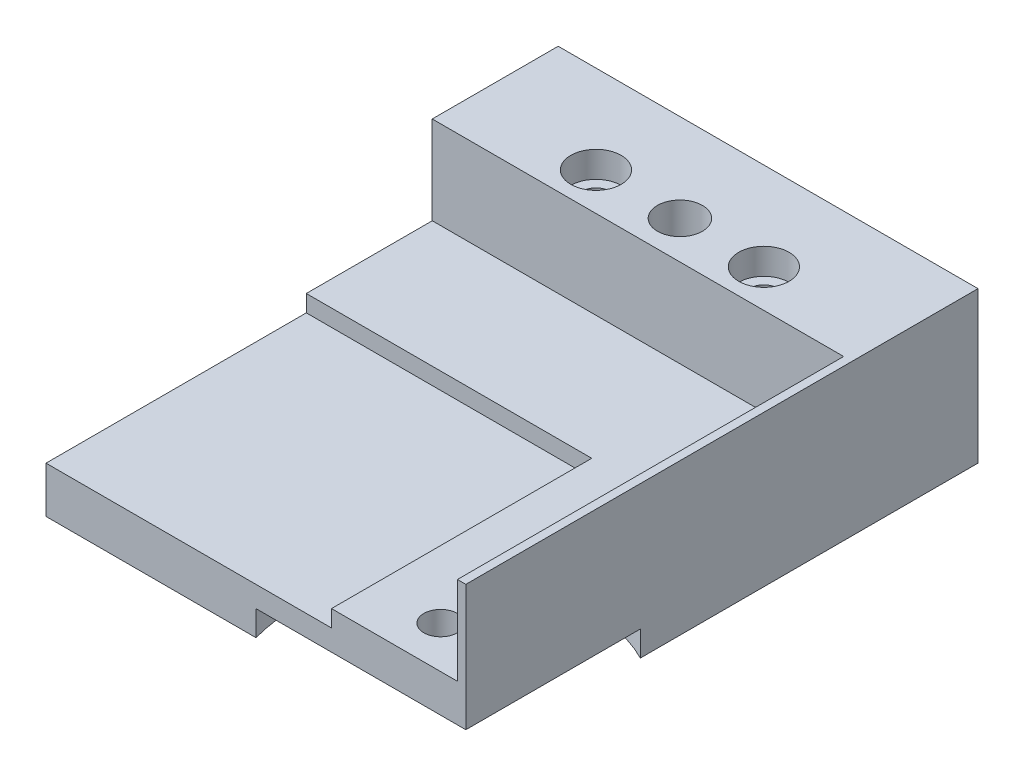
ISO-10303-21;
HEADER;
FILE_DESCRIPTION(('STEP AP214'),'2;1');
FILE_NAME('part.step','',(''),(''),'','','');
FILE_SCHEMA(('AUTOMOTIVE_DESIGN { 1 0 10303 214 1 1 1 1 }'));
ENDSEC;
DATA;
#1=APPLICATION_CONTEXT('core data for automotive mechanical design processes');
#2=APPLICATION_PROTOCOL_DEFINITION('international standard','automotive_design',2000,#1);
#3=PRODUCT_CONTEXT('',#1,'mechanical');
#4=PRODUCT('Part','Part','',(#3));
#5=PRODUCT_RELATED_PRODUCT_CATEGORY('part','',(#4));
#6=PRODUCT_DEFINITION_FORMATION('','',#4);
#7=PRODUCT_DEFINITION_CONTEXT('part definition',#1,'design');
#8=PRODUCT_DEFINITION('design','',#6,#7);
#9=PRODUCT_DEFINITION_SHAPE('','',#8);
#10=(LENGTH_UNIT() NAMED_UNIT(*) SI_UNIT(.MILLI.,.METRE.));
#11=(NAMED_UNIT(*) PLANE_ANGLE_UNIT() SI_UNIT($,.RADIAN.));
#12=(NAMED_UNIT(*) SI_UNIT($,.STERADIAN.) SOLID_ANGLE_UNIT());
#13=UNCERTAINTY_MEASURE_WITH_UNIT(LENGTH_MEASURE(1.E-05),#10,'distance_accuracy_value','');
#14=(GEOMETRIC_REPRESENTATION_CONTEXT(3) GLOBAL_UNCERTAINTY_ASSIGNED_CONTEXT((#13)) GLOBAL_UNIT_ASSIGNED_CONTEXT((#10,
#11,#12)) REPRESENTATION_CONTEXT('',''));
#15=CARTESIAN_POINT('',(0.,0.,0.));
#16=DIRECTION('',(0.,0.,1.));
#17=DIRECTION('',(1.,0.,0.));
#18=AXIS2_PLACEMENT_3D('',#15,#16,#17);
#19=CARTESIAN_POINT('',(25.,0.,-50.5));
#20=DIRECTION('',(0.,1.,0.));
#21=DIRECTION('',(0.,0.,1.));
#22=AXIS2_PLACEMENT_3D('',#19,#20,#21);
#23=CYLINDRICAL_SURFACE('',#22,2.675);
#24=CARTESIAN_POINT('',(25.,18.,-50.5));
#25=DIRECTION('',(0.,1.,0.));
#26=DIRECTION('',(0.,0.,1.));
#27=AXIS2_PLACEMENT_3D('',#24,#25,#26);
#28=CIRCLE('',#27,2.675);
#29=CARTESIAN_POINT('',(25.,18.,-47.825));
#30=VERTEX_POINT('',#29);
#31=EDGE_CURVE('E177',#30,#30,#28,.T.);
#32=ORIENTED_EDGE('',*,*,#31,.T.);
#33=EDGE_LOOP('',(#32));
#34=FACE_BOUND('',#33,.T.);
#35=CARTESIAN_POINT('',(25.,7.5,-50.5));
#36=DIRECTION('',(0.,-1.,0.));
#37=DIRECTION('',(0.,0.,-1.));
#38=AXIS2_PLACEMENT_3D('',#35,#36,#37);
#39=CIRCLE('',#38,2.675);
#40=CARTESIAN_POINT('',(25.,7.5,-53.175));
#41=VERTEX_POINT('',#40);
#42=EDGE_CURVE('E45',#41,#41,#39,.F.);
#43=ORIENTED_EDGE('',*,*,#42,.F.);
#44=EDGE_LOOP('',(#43));
#45=FACE_BOUND('',#44,.T.);
#46=ADVANCED_FACE('F41',(#34,#45),#23,.F.);
#47=CARTESIAN_POINT('',(15.,0.,-50.5));
#48=DIRECTION('',(0.,1.,0.));
#49=DIRECTION('',(0.,0.,1.));
#50=AXIS2_PLACEMENT_3D('',#47,#48,#49);
#51=CYLINDRICAL_SURFACE('',#50,1.75);
#52=CARTESIAN_POINT('',(15.,0.,-50.5));
#53=DIRECTION('',(0.,1.,0.));
#54=DIRECTION('',(0.,0.,1.));
#55=AXIS2_PLACEMENT_3D('',#52,#53,#54);
#56=CIRCLE('',#55,1.75);
#57=CARTESIAN_POINT('',(15.,0.,-48.75));
#58=VERTEX_POINT('',#57);
#59=EDGE_CURVE('E173',#58,#58,#56,.T.);
#60=ORIENTED_EDGE('',*,*,#59,.F.);
#61=EDGE_LOOP('',(#60));
#62=FACE_BOUND('',#61,.T.);
#63=CARTESIAN_POINT('',(15.,14.9,-50.5));
#64=DIRECTION('',(0.,1.,0.));
#65=DIRECTION('',(0.,0.,1.));
#66=AXIS2_PLACEMENT_3D('',#63,#64,#65);
#67=CIRCLE('',#66,1.75);
#68=CARTESIAN_POINT('',(15.,14.9,-48.75));
#69=VERTEX_POINT('',#68);
#70=EDGE_CURVE('E170',#69,#69,#67,.F.);
#71=ORIENTED_EDGE('',*,*,#70,.F.);
#72=EDGE_LOOP('',(#71));
#73=FACE_BOUND('',#72,.T.);
#74=ADVANCED_FACE('F295',(#62,#73),#51,.F.);
#75=CARTESIAN_POINT('',(35.,0.,-50.5));
#76=DIRECTION('',(0.,1.,0.));
#77=DIRECTION('',(0.,0.,1.));
#78=AXIS2_PLACEMENT_3D('',#75,#76,#77);
#79=CYLINDRICAL_SURFACE('',#78,1.75);
#80=CARTESIAN_POINT('',(35.,0.,-50.5));
#81=DIRECTION('',(0.,1.,0.));
#82=DIRECTION('',(0.,0.,1.));
#83=AXIS2_PLACEMENT_3D('',#80,#81,#82);
#84=CIRCLE('',#83,1.75);
#85=CARTESIAN_POINT('',(35.,0.,-48.75));
#86=VERTEX_POINT('',#85);
#87=EDGE_CURVE('E182',#86,#86,#84,.T.);
#88=ORIENTED_EDGE('',*,*,#87,.F.);
#89=EDGE_LOOP('',(#88));
#90=FACE_BOUND('',#89,.T.);
#91=CARTESIAN_POINT('',(35.,14.9,-50.5));
#92=DIRECTION('',(0.,1.,0.));
#93=DIRECTION('',(0.,0.,1.));
#94=AXIS2_PLACEMENT_3D('',#91,#92,#93);
#95=CIRCLE('',#94,1.75);
#96=CARTESIAN_POINT('',(35.,14.9,-48.75));
#97=VERTEX_POINT('',#96);
#98=EDGE_CURVE('E168',#97,#97,#95,.F.);
#99=ORIENTED_EDGE('',*,*,#98,.F.);
#100=EDGE_LOOP('',(#99));
#101=FACE_BOUND('',#100,.T.);
#102=ADVANCED_FACE('F303',(#90,#101),#79,.F.);
#103=CARTESIAN_POINT('',(42.,18.,-5.));
#104=DIRECTION('',(0.,-1.,0.));
#105=DIRECTION('',(0.,0.,-1.));
#106=AXIS2_PLACEMENT_3D('',#103,#104,#105);
#107=CYLINDRICAL_SURFACE('',#106,2.);
#108=CARTESIAN_POINT('',(42.,7.5,-5.));
#109=DIRECTION('',(0.,-1.,0.));
#110=DIRECTION('',(0.,0.,-1.));
#111=AXIS2_PLACEMENT_3D('',#108,#109,#110);
#112=CIRCLE('',#111,2.);
#113=CARTESIAN_POINT('',(42.,7.5,-7.));
#114=VERTEX_POINT('',#113);
#115=EDGE_CURVE('E158',#114,#114,#112,.T.);
#116=ORIENTED_EDGE('',*,*,#115,.F.);
#117=EDGE_LOOP('',(#116));
#118=FACE_BOUND('',#117,.T.);
#119=CARTESIAN_POINT('',(42.,3.,-5.));
#120=DIRECTION('',(0.,-1.,0.));
#121=DIRECTION('',(0.,0.,-1.));
#122=AXIS2_PLACEMENT_3D('',#119,#120,#121);
#123=CIRCLE('',#122,2.);
#124=CARTESIAN_POINT('',(42.,3.,-7.));
#125=VERTEX_POINT('',#124);
#126=EDGE_CURVE('E163',#125,#125,#123,.T.);
#127=ORIENTED_EDGE('',*,*,#126,.T.);
#128=EDGE_LOOP('',(#127));
#129=FACE_BOUND('',#128,.T.);
#130=ADVANCED_FACE('F310',(#118,#129),#107,.F.);
#131=CARTESIAN_POINT('',(0.,18.,0.));
#132=DIRECTION('',(0.,-1.,0.));
#133=DIRECTION('',(0.,0.,-1.));
#134=AXIS2_PLACEMENT_3D('',#131,#132,#133);
#135=PLANE('',#134);
#136=CARTESIAN_POINT('',(35.,18.,-50.5));
#137=DIRECTION('',(0.,1.,0.));
#138=DIRECTION('',(0.,0.,1.));
#139=AXIS2_PLACEMENT_3D('',#136,#137,#138);
#140=CIRCLE('',#139,3.);
#141=CARTESIAN_POINT('',(35.,18.,-47.5));
#142=VERTEX_POINT('',#141);
#143=EDGE_CURVE('E352',#142,#142,#140,.T.);
#144=ORIENTED_EDGE('',*,*,#143,.F.);
#145=EDGE_LOOP('',(#144));
#146=FACE_BOUND('',#145,.T.);
#147=CARTESIAN_POINT('',(15.,18.,-50.5));
#148=DIRECTION('',(0.,1.,0.));
#149=DIRECTION('',(0.,0.,1.));
#150=AXIS2_PLACEMENT_3D('',#147,#148,#149);
#151=CIRCLE('',#150,3.);
#152=CARTESIAN_POINT('',(15.,18.,-47.5));
#153=VERTEX_POINT('',#152);
#154=EDGE_CURVE('E343',#153,#153,#151,.T.);
#155=ORIENTED_EDGE('',*,*,#154,.F.);
#156=EDGE_LOOP('',(#155));
#157=FACE_BOUND('',#156,.T.);
#158=ORIENTED_EDGE('',*,*,#31,.F.);
#159=EDGE_LOOP('',(#158));
#160=FACE_BOUND('',#159,.T.);
#161=DIRECTION('',(0.,0.,1.));
#162=VECTOR('',#161,1.);
#163=CARTESIAN_POINT('',(0.,18.,0.));
#164=LINE('',#163,#162);
#165=CARTESIAN_POINT('',(0.,18.,-61.));
#166=VERTEX_POINT('',#165);
#167=CARTESIAN_POINT('',(0.,18.,-46.));
#168=VERTEX_POINT('',#167);
#169=EDGE_CURVE('E232',#166,#168,#164,.T.);
#170=ORIENTED_EDGE('',*,*,#169,.T.);
#171=DIRECTION('',(-1.,0.,0.));
#172=VECTOR('',#171,1.);
#173=CARTESIAN_POINT('',(0.,18.,-46.));
#174=LINE('',#173,#172);
#175=CARTESIAN_POINT('',(49.,18.,-46.));
#176=VERTEX_POINT('',#175);
#177=EDGE_CURVE('E215',#176,#168,#174,.T.);
#178=ORIENTED_EDGE('',*,*,#177,.F.);
#179=DIRECTION('',(0.,0.,-1.));
#180=VECTOR('',#179,1.);
#181=CARTESIAN_POINT('',(49.,18.,0.));
#182=LINE('',#181,#180);
#183=CARTESIAN_POINT('',(49.,18.,0.));
#184=VERTEX_POINT('',#183);
#185=EDGE_CURVE('E207',#184,#176,#182,.T.);
#186=ORIENTED_EDGE('',*,*,#185,.F.);
#187=DIRECTION('',(1.,0.,0.));
#188=VECTOR('',#187,1.);
#189=CARTESIAN_POINT('',(0.,18.,0.));
#190=LINE('',#189,#188);
#191=CARTESIAN_POINT('',(50.,18.,0.));
#192=VERTEX_POINT('',#191);
#193=EDGE_CURVE('E235',#184,#192,#190,.T.);
#194=ORIENTED_EDGE('',*,*,#193,.T.);
#195=DIRECTION('',(0.,0.,-1.));
#196=VECTOR('',#195,1.);
#197=CARTESIAN_POINT('',(50.,18.,0.));
#198=LINE('',#197,#196);
#199=CARTESIAN_POINT('',(50.,18.,-61.));
#200=VERTEX_POINT('',#199);
#201=EDGE_CURVE('E150',#192,#200,#198,.T.);
#202=ORIENTED_EDGE('',*,*,#201,.T.);
#203=DIRECTION('',(-1.,0.,0.));
#204=VECTOR('',#203,1.);
#205=CARTESIAN_POINT('',(0.,18.,-61.));
#206=LINE('',#205,#204);
#207=EDGE_CURVE('E239',#200,#166,#206,.T.);
#208=ORIENTED_EDGE('',*,*,#207,.T.);
#209=EDGE_LOOP('',(#170,#178,#186,#194,#202,#208));
#210=FACE_BOUND('',#209,.T.);
#211=ADVANCED_FACE('F277',(#146,#157,#160,#210),#135,.F.);
#212=CARTESIAN_POINT('',(0.,0.,0.));
#213=DIRECTION('',(0.,-1.,0.));
#214=DIRECTION('',(0.,0.,-1.));
#215=AXIS2_PLACEMENT_3D('',#212,#213,#214);
#216=PLANE('',#215);
#217=CARTESIAN_POINT('',(25.,0.,-50.5));
#218=DIRECTION('',(0.,-1.,0.));
#219=DIRECTION('',(0.,0.,-1.));
#220=AXIS2_PLACEMENT_3D('',#217,#218,#219);
#221=CIRCLE('',#220,4.125);
#222=CARTESIAN_POINT('',(25.,0.,-54.625));
#223=VERTEX_POINT('',#222);
#224=EDGE_CURVE('E345',#223,#223,#221,.T.);
#225=ORIENTED_EDGE('',*,*,#224,.F.);
#226=EDGE_LOOP('',(#225));
#227=FACE_BOUND('',#226,.T.);
#228=ORIENTED_EDGE('',*,*,#87,.T.);
#229=EDGE_LOOP('',(#228));
#230=FACE_BOUND('',#229,.T.);
#231=ORIENTED_EDGE('',*,*,#59,.T.);
#232=EDGE_LOOP('',(#231));
#233=FACE_BOUND('',#232,.T.);
#234=CARTESIAN_POINT('',(42.,0.,-5.));
#235=DIRECTION('',(0.,-1.,0.));
#236=DIRECTION('',(0.,0.,-1.));
#237=AXIS2_PLACEMENT_3D('',#234,#235,#236);
#238=CIRCLE('',#237,17.7);
#239=CARTESIAN_POINT('',(25.0208951943867,0.,0.));
#240=VERTEX_POINT('',#239);
#241=CARTESIAN_POINT('',(50.,0.,-20.7889201657365));
#242=VERTEX_POINT('',#241);
#243=EDGE_CURVE('E137',#240,#242,#238,.T.);
#244=ORIENTED_EDGE('',*,*,#243,.F.);
#245=DIRECTION('',(1.,0.,0.));
#246=VECTOR('',#245,1.);
#247=CARTESIAN_POINT('',(0.,0.,0.));
#248=LINE('',#247,#246);
#249=CARTESIAN_POINT('',(0.,0.,0.));
#250=VERTEX_POINT('',#249);
#251=EDGE_CURVE('E243',#250,#240,#248,.T.);
#252=ORIENTED_EDGE('',*,*,#251,.F.);
#253=DIRECTION('',(0.,0.,1.));
#254=VECTOR('',#253,1.);
#255=CARTESIAN_POINT('',(0.,0.,0.));
#256=LINE('',#255,#254);
#257=CARTESIAN_POINT('',(0.,0.,-61.));
#258=VERTEX_POINT('',#257);
#259=EDGE_CURVE('E161',#258,#250,#256,.T.);
#260=ORIENTED_EDGE('',*,*,#259,.F.);
#261=DIRECTION('',(-1.,0.,0.));
#262=VECTOR('',#261,1.);
#263=CARTESIAN_POINT('',(0.,0.,-61.));
#264=LINE('',#263,#262);
#265=CARTESIAN_POINT('',(50.,0.,-61.));
#266=VERTEX_POINT('',#265);
#267=EDGE_CURVE('E236',#266,#258,#264,.T.);
#268=ORIENTED_EDGE('',*,*,#267,.F.);
#269=DIRECTION('',(0.,0.,-1.));
#270=VECTOR('',#269,1.);
#271=CARTESIAN_POINT('',(50.,0.,0.));
#272=LINE('',#271,#270);
#273=EDGE_CURVE('E245',#242,#266,#272,.T.);
#274=ORIENTED_EDGE('',*,*,#273,.F.);
#275=EDGE_LOOP('',(#244,#252,#260,#268,#274));
#276=FACE_BOUND('',#275,.T.);
#277=ADVANCED_FACE('F260',(#227,#230,#233,#276),#216,.T.);
#278=CARTESIAN_POINT('',(0.,18.,0.));
#279=DIRECTION('',(1.,0.,0.));
#280=DIRECTION('',(0.,0.,-1.));
#281=AXIS2_PLACEMENT_3D('',#278,#279,#280);
#282=PLANE('',#281);
#283=DIRECTION('',(0.,0.,1.));
#284=VECTOR('',#283,1.);
#285=CARTESIAN_POINT('',(0.,5.5,0.));
#286=LINE('',#285,#284);
#287=CARTESIAN_POINT('',(0.,5.5,-31.));
#288=VERTEX_POINT('',#287);
#289=CARTESIAN_POINT('',(0.,5.5,0.));
#290=VERTEX_POINT('',#289);
#291=EDGE_CURVE('E190',#288,#290,#286,.T.);
#292=ORIENTED_EDGE('',*,*,#291,.F.);
#293=DIRECTION('',(0.,1.,0.));
#294=VECTOR('',#293,1.);
#295=CARTESIAN_POINT('',(0.,5.5,-31.));
#296=LINE('',#295,#294);
#297=CARTESIAN_POINT('',(0.,7.5,-31.));
#298=VERTEX_POINT('',#297);
#299=EDGE_CURVE('E204',#288,#298,#296,.T.);
#300=ORIENTED_EDGE('',*,*,#299,.T.);
#301=DIRECTION('',(0.,0.,1.));
#302=VECTOR('',#301,1.);
#303=CARTESIAN_POINT('',(0.,7.5,0.));
#304=LINE('',#303,#302);
#305=CARTESIAN_POINT('',(0.,7.5,-46.));
#306=VERTEX_POINT('',#305);
#307=EDGE_CURVE('E211',#306,#298,#304,.T.);
#308=ORIENTED_EDGE('',*,*,#307,.F.);
#309=DIRECTION('',(0.,1.,0.));
#310=VECTOR('',#309,1.);
#311=CARTESIAN_POINT('',(0.,7.5,-46.));
#312=LINE('',#311,#310);
#313=EDGE_CURVE('E162',#306,#168,#312,.T.);
#314=ORIENTED_EDGE('',*,*,#313,.T.);
#315=ORIENTED_EDGE('',*,*,#169,.F.);
#316=DIRECTION('',(0.,-1.,0.));
#317=VECTOR('',#316,1.);
#318=CARTESIAN_POINT('',(0.,18.,-61.));
#319=LINE('',#318,#317);
#320=EDGE_CURVE('E154',#166,#258,#319,.T.);
#321=ORIENTED_EDGE('',*,*,#320,.T.);
#322=ORIENTED_EDGE('',*,*,#259,.T.);
#323=DIRECTION('',(0.,-1.,0.));
#324=VECTOR('',#323,1.);
#325=CARTESIAN_POINT('',(0.,18.,0.));
#326=LINE('',#325,#324);
#327=EDGE_CURVE('E11',#290,#250,#326,.T.);
#328=ORIENTED_EDGE('',*,*,#327,.F.);
#329=EDGE_LOOP('',(#292,#300,#308,#314,#315,#321,#322,#328));
#330=FACE_BOUND('',#329,.T.);
#331=ADVANCED_FACE('F43',(#330),#282,.F.);
#332=CARTESIAN_POINT('',(0.,18.,0.));
#333=DIRECTION('',(0.,0.,-1.));
#334=DIRECTION('',(-1.,0.,0.));
#335=AXIS2_PLACEMENT_3D('',#332,#333,#334);
#336=PLANE('',#335);
#337=ORIENTED_EDGE('',*,*,#251,.T.);
#338=DIRECTION('',(0.,-1.,0.));
#339=VECTOR('',#338,1.);
#340=CARTESIAN_POINT('',(25.0208951943867,3.,0.));
#341=LINE('',#340,#339);
#342=CARTESIAN_POINT('',(25.0208951943867,3.,0.));
#343=VERTEX_POINT('',#342);
#344=EDGE_CURVE('E146',#343,#240,#341,.T.);
#345=ORIENTED_EDGE('',*,*,#344,.F.);
#346=DIRECTION('',(-1.,0.,0.));
#347=VECTOR('',#346,1.);
#348=CARTESIAN_POINT('',(25.0208951943867,3.,0.));
#349=LINE('',#348,#347);
#350=CARTESIAN_POINT('',(50.,3.,0.));
#351=VERTEX_POINT('',#350);
#352=EDGE_CURVE('E133',#351,#343,#349,.T.);
#353=ORIENTED_EDGE('',*,*,#352,.F.);
#354=DIRECTION('',(0.,-1.,0.));
#355=VECTOR('',#354,1.);
#356=CARTESIAN_POINT('',(50.,18.,0.));
#357=LINE('',#356,#355);
#358=EDGE_CURVE('E50',#192,#351,#357,.T.);
#359=ORIENTED_EDGE('',*,*,#358,.F.);
#360=ORIENTED_EDGE('',*,*,#193,.F.);
#361=DIRECTION('',(0.,1.,0.));
#362=VECTOR('',#361,1.);
#363=CARTESIAN_POINT('',(49.,7.5,0.));
#364=LINE('',#363,#362);
#365=CARTESIAN_POINT('',(49.,7.5,0.));
#366=VERTEX_POINT('',#365);
#367=EDGE_CURVE('E223',#366,#184,#364,.T.);
#368=ORIENTED_EDGE('',*,*,#367,.F.);
#369=DIRECTION('',(1.,0.,0.));
#370=VECTOR('',#369,1.);
#371=CARTESIAN_POINT('',(0.,7.5,0.));
#372=LINE('',#371,#370);
#373=CARTESIAN_POINT('',(34.,7.5,0.));
#374=VERTEX_POINT('',#373);
#375=EDGE_CURVE('E214',#374,#366,#372,.T.);
#376=ORIENTED_EDGE('',*,*,#375,.F.);
#377=DIRECTION('',(0.,1.,0.));
#378=VECTOR('',#377,1.);
#379=CARTESIAN_POINT('',(34.,5.5,0.));
#380=LINE('',#379,#378);
#381=CARTESIAN_POINT('',(34.,5.5,0.));
#382=VERTEX_POINT('',#381);
#383=EDGE_CURVE('E66',#382,#374,#380,.T.);
#384=ORIENTED_EDGE('',*,*,#383,.F.);
#385=DIRECTION('',(1.,0.,0.));
#386=VECTOR('',#385,1.);
#387=CARTESIAN_POINT('',(0.,5.5,0.));
#388=LINE('',#387,#386);
#389=EDGE_CURVE('E192',#290,#382,#388,.T.);
#390=ORIENTED_EDGE('',*,*,#389,.F.);
#391=ORIENTED_EDGE('',*,*,#327,.T.);
#392=EDGE_LOOP('',(#337,#345,#353,#359,#360,#368,#376,#384,#390,#391));
#393=FACE_BOUND('',#392,.T.);
#394=ADVANCED_FACE('F143',(#393),#336,.F.);
#395=CARTESIAN_POINT('',(50.,18.,0.));
#396=DIRECTION('',(-1.,0.,0.));
#397=DIRECTION('',(0.,0.,1.));
#398=AXIS2_PLACEMENT_3D('',#395,#396,#397);
#399=PLANE('',#398);
#400=DIRECTION('',(0.,0.,1.));
#401=VECTOR('',#400,1.);
#402=CARTESIAN_POINT('',(50.,3.,0.));
#403=LINE('',#402,#401);
#404=CARTESIAN_POINT('',(50.,3.,-20.7889201657365));
#405=VERTEX_POINT('',#404);
#406=EDGE_CURVE('E130',#405,#351,#403,.T.);
#407=ORIENTED_EDGE('',*,*,#406,.F.);
#408=DIRECTION('',(0.,-1.,0.));
#409=VECTOR('',#408,1.);
#410=CARTESIAN_POINT('',(50.,3.,-20.7889201657365));
#411=LINE('',#410,#409);
#412=EDGE_CURVE('E167',#405,#242,#411,.T.);
#413=ORIENTED_EDGE('',*,*,#412,.T.);
#414=ORIENTED_EDGE('',*,*,#273,.T.);
#415=DIRECTION('',(0.,-1.,0.));
#416=VECTOR('',#415,1.);
#417=CARTESIAN_POINT('',(50.,18.,-61.));
#418=LINE('',#417,#416);
#419=EDGE_CURVE('E151',#200,#266,#418,.T.);
#420=ORIENTED_EDGE('',*,*,#419,.F.);
#421=ORIENTED_EDGE('',*,*,#201,.F.);
#422=ORIENTED_EDGE('',*,*,#358,.T.);
#423=EDGE_LOOP('',(#407,#413,#414,#420,#421,#422));
#424=FACE_BOUND('',#423,.T.);
#425=ADVANCED_FACE('F148',(#424),#399,.F.);
#426=CARTESIAN_POINT('',(0.,18.,-61.));
#427=DIRECTION('',(0.,0.,1.));
#428=DIRECTION('',(1.,0.,0.));
#429=AXIS2_PLACEMENT_3D('',#426,#427,#428);
#430=PLANE('',#429);
#431=ORIENTED_EDGE('',*,*,#267,.T.);
#432=ORIENTED_EDGE('',*,*,#320,.F.);
#433=ORIENTED_EDGE('',*,*,#207,.F.);
#434=ORIENTED_EDGE('',*,*,#419,.T.);
#435=EDGE_LOOP('',(#431,#432,#433,#434));
#436=FACE_BOUND('',#435,.T.);
#437=ADVANCED_FACE('F279',(#436),#430,.F.);
#438=CARTESIAN_POINT('',(0.,7.5,-46.));
#439=DIRECTION('',(0.,0.,-1.));
#440=DIRECTION('',(-1.,0.,0.));
#441=AXIS2_PLACEMENT_3D('',#438,#439,#440);
#442=PLANE('',#441);
#443=ORIENTED_EDGE('',*,*,#177,.T.);
#444=ORIENTED_EDGE('',*,*,#313,.F.);
#445=DIRECTION('',(-1.,0.,0.));
#446=VECTOR('',#445,1.);
#447=CARTESIAN_POINT('',(0.,7.5,-46.));
#448=LINE('',#447,#446);
#449=CARTESIAN_POINT('',(49.,7.5,-46.));
#450=VERTEX_POINT('',#449);
#451=EDGE_CURVE('E220',#450,#306,#448,.T.);
#452=ORIENTED_EDGE('',*,*,#451,.F.);
#453=DIRECTION('',(0.,1.,0.));
#454=VECTOR('',#453,1.);
#455=CARTESIAN_POINT('',(49.,7.5,-46.));
#456=LINE('',#455,#454);
#457=EDGE_CURVE('E229',#450,#176,#456,.T.);
#458=ORIENTED_EDGE('',*,*,#457,.T.);
#459=EDGE_LOOP('',(#443,#444,#452,#458));
#460=FACE_BOUND('',#459,.T.);
#461=ADVANCED_FACE('F375',(#460),#442,.F.);
#462=CARTESIAN_POINT('',(49.,7.5,0.));
#463=DIRECTION('',(1.,0.,0.));
#464=DIRECTION('',(0.,0.,-1.));
#465=AXIS2_PLACEMENT_3D('',#462,#463,#464);
#466=PLANE('',#465);
#467=ORIENTED_EDGE('',*,*,#185,.T.);
#468=ORIENTED_EDGE('',*,*,#457,.F.);
#469=DIRECTION('',(0.,0.,-1.));
#470=VECTOR('',#469,1.);
#471=CARTESIAN_POINT('',(49.,7.5,0.));
#472=LINE('',#471,#470);
#473=EDGE_CURVE('E217',#366,#450,#472,.T.);
#474=ORIENTED_EDGE('',*,*,#473,.F.);
#475=ORIENTED_EDGE('',*,*,#367,.T.);
#476=EDGE_LOOP('',(#467,#468,#474,#475));
#477=FACE_BOUND('',#476,.T.);
#478=ADVANCED_FACE('F404',(#477),#466,.F.);
#479=CARTESIAN_POINT('',(0.,7.5,0.));
#480=DIRECTION('',(0.,-1.,0.));
#481=DIRECTION('',(0.,0.,-1.));
#482=AXIS2_PLACEMENT_3D('',#479,#480,#481);
#483=PLANE('',#482);
#484=ORIENTED_EDGE('',*,*,#115,.T.);
#485=EDGE_LOOP('',(#484));
#486=FACE_BOUND('',#485,.T.);
#487=ORIENTED_EDGE('',*,*,#307,.T.);
#488=DIRECTION('',(-1.,0.,0.));
#489=VECTOR('',#488,1.);
#490=CARTESIAN_POINT('',(0.,7.5,-31.));
#491=LINE('',#490,#489);
#492=CARTESIAN_POINT('',(34.,7.5,-31.));
#493=VERTEX_POINT('',#492);
#494=EDGE_CURVE('E193',#493,#298,#491,.T.);
#495=ORIENTED_EDGE('',*,*,#494,.F.);
#496=DIRECTION('',(0.,0.,-1.));
#497=VECTOR('',#496,1.);
#498=CARTESIAN_POINT('',(34.,7.5,0.));
#499=LINE('',#498,#497);
#500=EDGE_CURVE('E166',#374,#493,#499,.T.);
#501=ORIENTED_EDGE('',*,*,#500,.F.);
#502=ORIENTED_EDGE('',*,*,#375,.T.);
#503=ORIENTED_EDGE('',*,*,#473,.T.);
#504=ORIENTED_EDGE('',*,*,#451,.T.);
#505=EDGE_LOOP('',(#487,#495,#501,#502,#503,#504));
#506=FACE_BOUND('',#505,.T.);
#507=ADVANCED_FACE('F271',(#486,#506),#483,.F.);
#508=CARTESIAN_POINT('',(0.,5.5,-31.));
#509=DIRECTION('',(0.,0.,-1.));
#510=DIRECTION('',(-1.,0.,0.));
#511=AXIS2_PLACEMENT_3D('',#508,#509,#510);
#512=PLANE('',#511);
#513=ORIENTED_EDGE('',*,*,#494,.T.);
#514=ORIENTED_EDGE('',*,*,#299,.F.);
#515=DIRECTION('',(-1.,0.,0.));
#516=VECTOR('',#515,1.);
#517=CARTESIAN_POINT('',(0.,5.5,-31.));
#518=LINE('',#517,#516);
#519=CARTESIAN_POINT('',(34.,5.5,-31.));
#520=VERTEX_POINT('',#519);
#521=EDGE_CURVE('E199',#520,#288,#518,.T.);
#522=ORIENTED_EDGE('',*,*,#521,.F.);
#523=DIRECTION('',(0.,1.,0.));
#524=VECTOR('',#523,1.);
#525=CARTESIAN_POINT('',(34.,5.5,-31.));
#526=LINE('',#525,#524);
#527=EDGE_CURVE('E208',#520,#493,#526,.T.);
#528=ORIENTED_EDGE('',*,*,#527,.T.);
#529=EDGE_LOOP('',(#513,#514,#522,#528));
#530=FACE_BOUND('',#529,.T.);
#531=ADVANCED_FACE('F268',(#530),#512,.F.);
#532=CARTESIAN_POINT('',(34.,5.5,0.));
#533=DIRECTION('',(1.,0.,0.));
#534=DIRECTION('',(0.,0.,-1.));
#535=AXIS2_PLACEMENT_3D('',#532,#533,#534);
#536=PLANE('',#535);
#537=ORIENTED_EDGE('',*,*,#500,.T.);
#538=ORIENTED_EDGE('',*,*,#527,.F.);
#539=DIRECTION('',(0.,0.,-1.));
#540=VECTOR('',#539,1.);
#541=CARTESIAN_POINT('',(34.,5.5,0.));
#542=LINE('',#541,#540);
#543=EDGE_CURVE('E196',#382,#520,#542,.T.);
#544=ORIENTED_EDGE('',*,*,#543,.F.);
#545=ORIENTED_EDGE('',*,*,#383,.T.);
#546=EDGE_LOOP('',(#537,#538,#544,#545));
#547=FACE_BOUND('',#546,.T.);
#548=ADVANCED_FACE('F292',(#547),#536,.F.);
#549=CARTESIAN_POINT('',(0.,5.5,0.));
#550=DIRECTION('',(0.,-1.,0.));
#551=DIRECTION('',(0.,0.,-1.));
#552=AXIS2_PLACEMENT_3D('',#549,#550,#551);
#553=PLANE('',#552);
#554=ORIENTED_EDGE('',*,*,#291,.T.);
#555=ORIENTED_EDGE('',*,*,#389,.T.);
#556=ORIENTED_EDGE('',*,*,#543,.T.);
#557=ORIENTED_EDGE('',*,*,#521,.T.);
#558=EDGE_LOOP('',(#554,#555,#556,#557));
#559=FACE_BOUND('',#558,.T.);
#560=ADVANCED_FACE('F265',(#559),#553,.F.);
#561=CARTESIAN_POINT('',(42.,3.,-5.));
#562=DIRECTION('',(0.,-1.,0.));
#563=DIRECTION('',(0.,0.,-1.));
#564=AXIS2_PLACEMENT_3D('',#561,#562,#563);
#565=CYLINDRICAL_SURFACE('',#564,17.7);
#566=ORIENTED_EDGE('',*,*,#243,.T.);
#567=ORIENTED_EDGE('',*,*,#412,.F.);
#568=CARTESIAN_POINT('',(42.,3.,-5.));
#569=DIRECTION('',(0.,-1.,0.));
#570=DIRECTION('',(0.,0.,-1.));
#571=AXIS2_PLACEMENT_3D('',#568,#569,#570);
#572=CIRCLE('',#571,17.7);
#573=EDGE_CURVE('E58',#343,#405,#572,.T.);
#574=ORIENTED_EDGE('',*,*,#573,.F.);
#575=ORIENTED_EDGE('',*,*,#344,.T.);
#576=EDGE_LOOP('',(#566,#567,#574,#575));
#577=FACE_BOUND('',#576,.T.);
#578=ADVANCED_FACE('F281',(#577),#565,.F.);
#579=CARTESIAN_POINT('',(42.,3.,-5.));
#580=DIRECTION('',(0.,-1.,0.));
#581=DIRECTION('',(0.,0.,-1.));
#582=AXIS2_PLACEMENT_3D('',#579,#580,#581);
#583=PLANE('',#582);
#584=ORIENTED_EDGE('',*,*,#126,.F.);
#585=EDGE_LOOP('',(#584));
#586=FACE_BOUND('',#585,.T.);
#587=ORIENTED_EDGE('',*,*,#406,.T.);
#588=ORIENTED_EDGE('',*,*,#352,.T.);
#589=ORIENTED_EDGE('',*,*,#573,.T.);
#590=EDGE_LOOP('',(#587,#588,#589));
#591=FACE_BOUND('',#590,.T.);
#592=ADVANCED_FACE('F132',(#586,#591),#583,.T.);
#593=CARTESIAN_POINT('',(35.,14.9,-50.5));
#594=DIRECTION('',(0.,1.,0.));
#595=DIRECTION('',(0.,0.,1.));
#596=AXIS2_PLACEMENT_3D('',#593,#594,#595);
#597=PLANE('',#596);
#598=CARTESIAN_POINT('',(35.,14.9,-50.5));
#599=DIRECTION('',(0.,1.,0.));
#600=DIRECTION('',(0.,0.,1.));
#601=AXIS2_PLACEMENT_3D('',#598,#599,#600);
#602=CIRCLE('',#601,3.);
#603=CARTESIAN_POINT('',(35.,14.9,-47.5));
#604=VERTEX_POINT('',#603);
#605=EDGE_CURVE('E171',#604,#604,#602,.T.);
#606=ORIENTED_EDGE('',*,*,#605,.T.);
#607=EDGE_LOOP('',(#606));
#608=FACE_BOUND('',#607,.T.);
#609=ORIENTED_EDGE('',*,*,#98,.T.);
#610=EDGE_LOOP('',(#609));
#611=FACE_BOUND('',#610,.T.);
#612=ADVANCED_FACE('F288',(#608,#611),#597,.T.);
#613=CARTESIAN_POINT('',(35.,14.9,-50.5));
#614=DIRECTION('',(0.,1.,0.));
#615=DIRECTION('',(0.,0.,1.));
#616=AXIS2_PLACEMENT_3D('',#613,#614,#615);
#617=CYLINDRICAL_SURFACE('',#616,3.);
#618=CARTESIAN_POINT('',(35.,14.9,-47.5));
#619=CARTESIAN_POINT('',(35.,14.9322916666667,-47.5));
#620=CARTESIAN_POINT('',(35.,14.9645833333333,-47.5));
#621=CARTESIAN_POINT('',(35.,15.0291666666667,-47.5));
#622=CARTESIAN_POINT('',(35.,15.0614583333333,-47.5));
#623=CARTESIAN_POINT('',(35.,15.1260416666667,-47.5));
#624=CARTESIAN_POINT('',(35.,15.1583333333333,-47.5));
#625=CARTESIAN_POINT('',(35.,15.2229166666667,-47.5));
#626=CARTESIAN_POINT('',(35.,15.2552083333333,-47.5));
#627=CARTESIAN_POINT('',(35.,15.3197916666667,-47.5));
#628=CARTESIAN_POINT('',(35.,15.3520833333333,-47.5));
#629=CARTESIAN_POINT('',(35.,15.4166666666667,-47.5));
#630=CARTESIAN_POINT('',(35.,15.4489583333333,-47.5));
#631=CARTESIAN_POINT('',(35.,15.5135416666667,-47.5));
#632=CARTESIAN_POINT('',(35.,15.5458333333333,-47.5));
#633=CARTESIAN_POINT('',(35.,15.6104166666667,-47.5));
#634=CARTESIAN_POINT('',(35.,15.6427083333333,-47.5));
#635=CARTESIAN_POINT('',(35.,15.7072916666667,-47.5));
#636=CARTESIAN_POINT('',(35.,15.7395833333333,-47.5));
#637=CARTESIAN_POINT('',(35.,15.8041666666667,-47.5));
#638=CARTESIAN_POINT('',(35.,15.8364583333333,-47.5));
#639=CARTESIAN_POINT('',(35.,15.9010416666667,-47.5));
#640=CARTESIAN_POINT('',(35.,15.9333333333333,-47.5));
#641=CARTESIAN_POINT('',(35.,15.9979166666667,-47.5));
#642=CARTESIAN_POINT('',(35.,16.0302083333333,-47.5));
#643=CARTESIAN_POINT('',(35.,16.0947916666667,-47.5));
#644=CARTESIAN_POINT('',(35.,16.1270833333333,-47.5));
#645=CARTESIAN_POINT('',(35.,16.1916666666667,-47.5));
#646=CARTESIAN_POINT('',(35.,16.2239583333333,-47.5));
#647=CARTESIAN_POINT('',(35.,16.2885416666667,-47.5));
#648=CARTESIAN_POINT('',(35.,16.3208333333333,-47.5));
#649=CARTESIAN_POINT('',(35.,16.3854166666667,-47.5));
#650=CARTESIAN_POINT('',(35.,16.4177083333333,-47.5));
#651=CARTESIAN_POINT('',(35.,16.4822916666667,-47.5));
#652=CARTESIAN_POINT('',(35.,16.5145833333333,-47.5));
#653=CARTESIAN_POINT('',(35.,16.5791666666667,-47.5));
#654=CARTESIAN_POINT('',(35.,16.6114583333333,-47.5));
#655=CARTESIAN_POINT('',(35.,16.6760416666667,-47.5));
#656=CARTESIAN_POINT('',(35.,16.7083333333333,-47.5));
#657=CARTESIAN_POINT('',(35.,16.7729166666667,-47.5));
#658=CARTESIAN_POINT('',(35.,16.8052083333333,-47.5));
#659=CARTESIAN_POINT('',(35.,16.8697916666667,-47.5));
#660=CARTESIAN_POINT('',(35.,16.9020833333333,-47.5));
#661=CARTESIAN_POINT('',(35.,16.9666666666667,-47.5));
#662=CARTESIAN_POINT('',(35.,16.9989583333333,-47.5));
#663=CARTESIAN_POINT('',(35.,17.0635416666667,-47.5));
#664=CARTESIAN_POINT('',(35.,17.0958333333333,-47.5));
#665=CARTESIAN_POINT('',(35.,17.1604166666667,-47.5));
#666=CARTESIAN_POINT('',(35.,17.1927083333333,-47.5));
#667=CARTESIAN_POINT('',(35.,17.2572916666667,-47.5));
#668=CARTESIAN_POINT('',(35.,17.2895833333333,-47.5));
#669=CARTESIAN_POINT('',(35.,17.3541666666667,-47.5));
#670=CARTESIAN_POINT('',(35.,17.3864583333333,-47.5));
#671=CARTESIAN_POINT('',(35.,17.4510416666667,-47.5));
#672=CARTESIAN_POINT('',(35.,17.4833333333333,-47.5));
#673=CARTESIAN_POINT('',(35.,17.5479166666667,-47.5));
#674=CARTESIAN_POINT('',(35.,17.5802083333333,-47.5));
#675=CARTESIAN_POINT('',(35.,17.6447916666667,-47.5));
#676=CARTESIAN_POINT('',(35.,17.6770833333333,-47.5));
#677=CARTESIAN_POINT('',(35.,17.7416666666667,-47.5));
#678=CARTESIAN_POINT('',(35.,17.7739583333333,-47.5));
#679=CARTESIAN_POINT('',(35.,17.8385416666667,-47.5));
#680=CARTESIAN_POINT('',(35.,17.8708333333333,-47.5));
#681=CARTESIAN_POINT('',(35.,17.9354166666667,-47.5));
#682=CARTESIAN_POINT('',(35.,17.9677083333333,-47.5));
#683=CARTESIAN_POINT('',(35.,18.,-47.5));
#684=B_SPLINE_CURVE_WITH_KNOTS('',3,(#618,#619,#620,#621,#622,#623,#624,#625,#626,#627,#628,
#629,#630,#631,#632,#633,#634,#635,#636,#637,#638,#639,#640,#641,#642,#643,#644,#645,#646,#647,
#648,#649,#650,#651,#652,#653,#654,#655,#656,#657,#658,#659,#660,#661,#662,#663,#664,#665,#666,
#667,#668,#669,#670,#671,#672,#673,#674,#675,#676,#677,#678,#679,#680,#681,#682,#683),
.UNSPECIFIED.,.F.,.F.,(4,2,2,2,2,2,2,2,2,2,2,2,2,2,2,2,2,2,2,2,2,2,2,2,2,2,2,2,2,2,2,2,4),(0.,
0.0968750000000015,0.193750000000001,0.290625000000001,0.387500000000001,0.484375,0.58125,
0.678125000000002,0.775000000000001,0.871875000000001,0.968750000000001,1.065625,1.1625,
1.259375,1.35625,1.453125,1.55,1.646875,1.74375,1.840625,1.9375,2.034375,2.13125,2.228125,2.325,
2.421875,2.51875,2.615625,2.7125,2.809375,2.90625,3.003125,3.1),.UNSPECIFIED.);
#685=EDGE_CURVE('BSEAM316',#604,#142,#684,.T.);
#686=ORIENTED_EDGE('',*,*,#605,.F.);
#687=ORIENTED_EDGE('',*,*,#143,.T.);
#688=ORIENTED_EDGE('',*,*,#685,.T.);
#689=ORIENTED_EDGE('',*,*,#685,.F.);
#690=EDGE_LOOP('',(#686,#688,#687,#689));
#691=FACE_BOUND('',#690,.T.);
#692=ADVANCED_FACE('F316',(#691),#617,.F.);
#693=CARTESIAN_POINT('',(15.,14.9,-50.5));
#694=DIRECTION('',(0.,1.,0.));
#695=DIRECTION('',(0.,0.,1.));
#696=AXIS2_PLACEMENT_3D('',#693,#694,#695);
#697=PLANE('',#696);
#698=CARTESIAN_POINT('',(15.,14.9,-50.5));
#699=DIRECTION('',(0.,1.,0.));
#700=DIRECTION('',(0.,0.,1.));
#701=AXIS2_PLACEMENT_3D('',#698,#699,#700);
#702=CIRCLE('',#701,3.);
#703=CARTESIAN_POINT('',(15.,14.9,-47.5));
#704=VERTEX_POINT('',#703);
#705=EDGE_CURVE('E341',#704,#704,#702,.T.);
#706=ORIENTED_EDGE('',*,*,#705,.T.);
#707=EDGE_LOOP('',(#706));
#708=FACE_BOUND('',#707,.T.);
#709=ORIENTED_EDGE('',*,*,#70,.T.);
#710=EDGE_LOOP('',(#709));
#711=FACE_BOUND('',#710,.T.);
#712=ADVANCED_FACE('F312',(#708,#711),#697,.T.);
#713=CARTESIAN_POINT('',(15.,14.9,-50.5));
#714=DIRECTION('',(0.,1.,0.));
#715=DIRECTION('',(0.,0.,1.));
#716=AXIS2_PLACEMENT_3D('',#713,#714,#715);
#717=CYLINDRICAL_SURFACE('',#716,3.);
#718=CARTESIAN_POINT('',(15.,14.9,-47.5));
#719=CARTESIAN_POINT('',(15.,14.9322916666667,-47.5));
#720=CARTESIAN_POINT('',(15.,14.9645833333333,-47.5));
#721=CARTESIAN_POINT('',(15.,15.0291666666667,-47.5));
#722=CARTESIAN_POINT('',(15.,15.0614583333333,-47.5));
#723=CARTESIAN_POINT('',(15.,15.1260416666667,-47.5));
#724=CARTESIAN_POINT('',(15.,15.1583333333333,-47.5));
#725=CARTESIAN_POINT('',(15.,15.2229166666667,-47.5));
#726=CARTESIAN_POINT('',(15.,15.2552083333333,-47.5));
#727=CARTESIAN_POINT('',(15.,15.3197916666667,-47.5));
#728=CARTESIAN_POINT('',(15.,15.3520833333333,-47.5));
#729=CARTESIAN_POINT('',(15.,15.4166666666667,-47.5));
#730=CARTESIAN_POINT('',(15.,15.4489583333333,-47.5));
#731=CARTESIAN_POINT('',(15.,15.5135416666667,-47.5));
#732=CARTESIAN_POINT('',(15.,15.5458333333333,-47.5));
#733=CARTESIAN_POINT('',(15.,15.6104166666667,-47.5));
#734=CARTESIAN_POINT('',(15.,15.6427083333333,-47.5));
#735=CARTESIAN_POINT('',(15.,15.7072916666667,-47.5));
#736=CARTESIAN_POINT('',(15.,15.7395833333333,-47.5));
#737=CARTESIAN_POINT('',(15.,15.8041666666667,-47.5));
#738=CARTESIAN_POINT('',(15.,15.8364583333333,-47.5));
#739=CARTESIAN_POINT('',(15.,15.9010416666667,-47.5));
#740=CARTESIAN_POINT('',(15.,15.9333333333333,-47.5));
#741=CARTESIAN_POINT('',(15.,15.9979166666667,-47.5));
#742=CARTESIAN_POINT('',(15.,16.0302083333333,-47.5));
#743=CARTESIAN_POINT('',(15.,16.0947916666667,-47.5));
#744=CARTESIAN_POINT('',(15.,16.1270833333333,-47.5));
#745=CARTESIAN_POINT('',(15.,16.1916666666667,-47.5));
#746=CARTESIAN_POINT('',(15.,16.2239583333333,-47.5));
#747=CARTESIAN_POINT('',(15.,16.2885416666667,-47.5));
#748=CARTESIAN_POINT('',(15.,16.3208333333333,-47.5));
#749=CARTESIAN_POINT('',(15.,16.3854166666667,-47.5));
#750=CARTESIAN_POINT('',(15.,16.4177083333333,-47.5));
#751=CARTESIAN_POINT('',(15.,16.4822916666667,-47.5));
#752=CARTESIAN_POINT('',(15.,16.5145833333333,-47.5));
#753=CARTESIAN_POINT('',(15.,16.5791666666667,-47.5));
#754=CARTESIAN_POINT('',(15.,16.6114583333333,-47.5));
#755=CARTESIAN_POINT('',(15.,16.6760416666667,-47.5));
#756=CARTESIAN_POINT('',(15.,16.7083333333333,-47.5));
#757=CARTESIAN_POINT('',(15.,16.7729166666667,-47.5));
#758=CARTESIAN_POINT('',(15.,16.8052083333333,-47.5));
#759=CARTESIAN_POINT('',(15.,16.8697916666667,-47.5));
#760=CARTESIAN_POINT('',(15.,16.9020833333333,-47.5));
#761=CARTESIAN_POINT('',(15.,16.9666666666667,-47.5));
#762=CARTESIAN_POINT('',(15.,16.9989583333333,-47.5));
#763=CARTESIAN_POINT('',(15.,17.0635416666667,-47.5));
#764=CARTESIAN_POINT('',(15.,17.0958333333333,-47.5));
#765=CARTESIAN_POINT('',(15.,17.1604166666667,-47.5));
#766=CARTESIAN_POINT('',(15.,17.1927083333333,-47.5));
#767=CARTESIAN_POINT('',(15.,17.2572916666667,-47.5));
#768=CARTESIAN_POINT('',(15.,17.2895833333333,-47.5));
#769=CARTESIAN_POINT('',(15.,17.3541666666667,-47.5));
#770=CARTESIAN_POINT('',(15.,17.3864583333333,-47.5));
#771=CARTESIAN_POINT('',(15.,17.4510416666667,-47.5));
#772=CARTESIAN_POINT('',(15.,17.4833333333333,-47.5));
#773=CARTESIAN_POINT('',(15.,17.5479166666667,-47.5));
#774=CARTESIAN_POINT('',(15.,17.5802083333333,-47.5));
#775=CARTESIAN_POINT('',(15.,17.6447916666667,-47.5));
#776=CARTESIAN_POINT('',(15.,17.6770833333333,-47.5));
#777=CARTESIAN_POINT('',(15.,17.7416666666667,-47.5));
#778=CARTESIAN_POINT('',(15.,17.7739583333333,-47.5));
#779=CARTESIAN_POINT('',(15.,17.8385416666667,-47.5));
#780=CARTESIAN_POINT('',(15.,17.8708333333333,-47.5));
#781=CARTESIAN_POINT('',(15.,17.9354166666667,-47.5));
#782=CARTESIAN_POINT('',(15.,17.9677083333333,-47.5));
#783=CARTESIAN_POINT('',(15.,18.,-47.5));
#784=B_SPLINE_CURVE_WITH_KNOTS('',3,(#718,#719,#720,#721,#722,#723,#724,#725,#726,#727,#728,
#729,#730,#731,#732,#733,#734,#735,#736,#737,#738,#739,#740,#741,#742,#743,#744,#745,#746,#747,
#748,#749,#750,#751,#752,#753,#754,#755,#756,#757,#758,#759,#760,#761,#762,#763,#764,#765,#766,
#767,#768,#769,#770,#771,#772,#773,#774,#775,#776,#777,#778,#779,#780,#781,#782,#783),
.UNSPECIFIED.,.F.,.F.,(4,2,2,2,2,2,2,2,2,2,2,2,2,2,2,2,2,2,2,2,2,2,2,2,2,2,2,2,2,2,2,2,4),(0.,
0.0968750000000015,0.193750000000001,0.290625000000001,0.387500000000001,0.484375,0.58125,
0.678125000000002,0.775000000000001,0.871875000000001,0.968750000000001,1.065625,1.1625,
1.259375,1.35625,1.453125,1.55,1.646875,1.74375,1.840625,1.9375,2.034375,2.13125,2.228125,2.325,
2.421875,2.51875,2.615625,2.7125,2.809375,2.90625,3.003125,3.1),.UNSPECIFIED.);
#785=EDGE_CURVE('BSEAM315',#704,#153,#784,.T.);
#786=ORIENTED_EDGE('',*,*,#705,.F.);
#787=ORIENTED_EDGE('',*,*,#154,.T.);
#788=ORIENTED_EDGE('',*,*,#785,.T.);
#789=ORIENTED_EDGE('',*,*,#785,.F.);
#790=EDGE_LOOP('',(#786,#788,#787,#789));
#791=FACE_BOUND('',#790,.T.);
#792=ADVANCED_FACE('F315',(#791),#717,.F.);
#793=CARTESIAN_POINT('',(25.,7.5,-50.5));
#794=DIRECTION('',(0.,-1.,0.));
#795=DIRECTION('',(0.,0.,-1.));
#796=AXIS2_PLACEMENT_3D('',#793,#794,#795);
#797=PLANE('',#796);
#798=CARTESIAN_POINT('',(25.,7.5,-50.5));
#799=DIRECTION('',(0.,-1.,0.));
#800=DIRECTION('',(0.,0.,-1.));
#801=AXIS2_PLACEMENT_3D('',#798,#799,#800);
#802=CIRCLE('',#801,4.125);
#803=CARTESIAN_POINT('',(25.,7.5,-54.625));
#804=VERTEX_POINT('',#803);
#805=EDGE_CURVE('E338',#804,#804,#802,.T.);
#806=ORIENTED_EDGE('',*,*,#805,.T.);
#807=EDGE_LOOP('',(#806));
#808=FACE_BOUND('',#807,.T.);
#809=ORIENTED_EDGE('',*,*,#42,.T.);
#810=EDGE_LOOP('',(#809));
#811=FACE_BOUND('',#810,.T.);
#812=ADVANCED_FACE('F319',(#808,#811),#797,.T.);
#813=CARTESIAN_POINT('',(25.,7.5,-50.5));
#814=DIRECTION('',(0.,-1.,0.));
#815=DIRECTION('',(0.,0.,-1.));
#816=AXIS2_PLACEMENT_3D('',#813,#814,#815);
#817=CYLINDRICAL_SURFACE('',#816,4.125);
#818=ORIENTED_EDGE('',*,*,#805,.F.);
#819=EDGE_LOOP('',(#818));
#820=FACE_BOUND('',#819,.T.);
#821=ORIENTED_EDGE('',*,*,#224,.T.);
#822=EDGE_LOOP('',(#821));
#823=FACE_BOUND('',#822,.T.);
#824=ADVANCED_FACE('F327',(#820,#823),#817,.F.);
#825=CLOSED_SHELL('',(#46,#74,#102,#130,#211,#277,#331,#394,#425,#437,#461,#478,#507,#531,#548,
#560,#578,#592,#612,#692,#712,#792,#812,#824));
#826=MANIFOLD_SOLID_BREP('B2',#825);
#827=ADVANCED_BREP_SHAPE_REPRESENTATION('',(#18,#826),#14);
#828=SHAPE_DEFINITION_REPRESENTATION(#9,#827);
ENDSEC;
END-ISO-10303-21;
